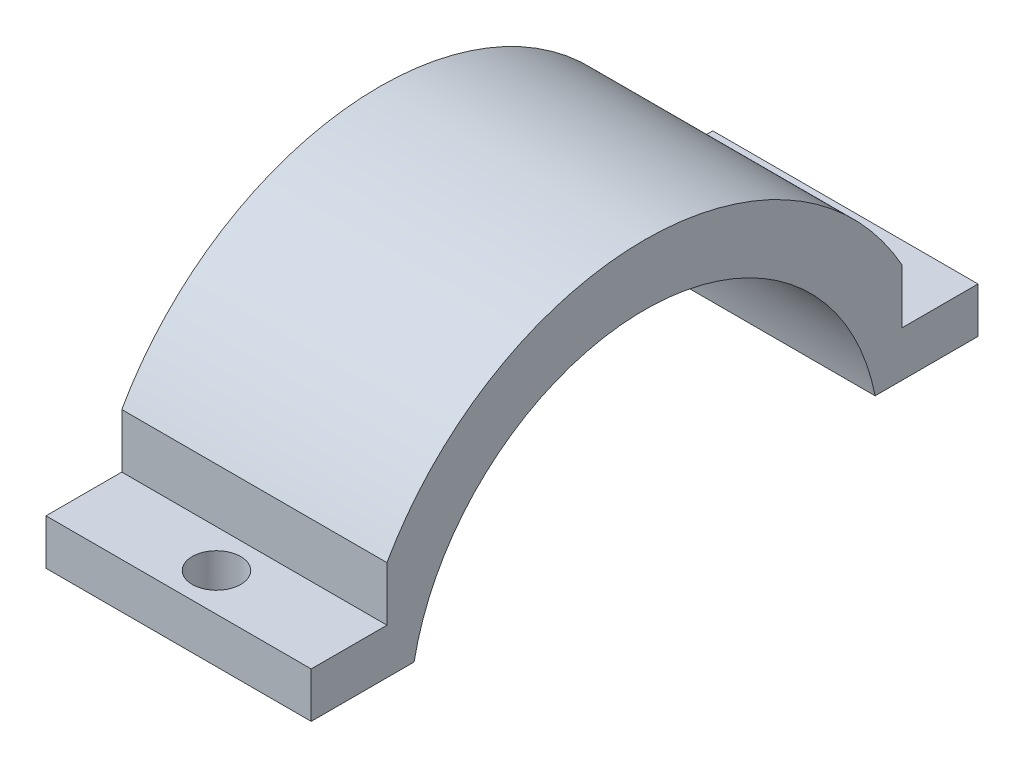
ISO-10303-21;
HEADER;
FILE_DESCRIPTION(('STEP AP214'),'2;1');
FILE_NAME('part.step','',(''),(''),'','','');
FILE_SCHEMA(('AUTOMOTIVE_DESIGN { 1 0 10303 214 1 1 1 1 }'));
ENDSEC;
DATA;
#1=APPLICATION_CONTEXT('core data for automotive mechanical design processes');
#2=APPLICATION_PROTOCOL_DEFINITION('international standard','automotive_design',2000,#1);
#3=PRODUCT_CONTEXT('',#1,'mechanical');
#4=PRODUCT('Part','Part','',(#3));
#5=PRODUCT_RELATED_PRODUCT_CATEGORY('part','',(#4));
#6=PRODUCT_DEFINITION_FORMATION('','',#4);
#7=PRODUCT_DEFINITION_CONTEXT('part definition',#1,'design');
#8=PRODUCT_DEFINITION('design','',#6,#7);
#9=PRODUCT_DEFINITION_SHAPE('','',#8);
#10=(LENGTH_UNIT() NAMED_UNIT(*) SI_UNIT(.MILLI.,.METRE.));
#11=(NAMED_UNIT(*) PLANE_ANGLE_UNIT() SI_UNIT($,.RADIAN.));
#12=(NAMED_UNIT(*) SI_UNIT($,.STERADIAN.) SOLID_ANGLE_UNIT());
#13=UNCERTAINTY_MEASURE_WITH_UNIT(LENGTH_MEASURE(1.E-05),#10,'distance_accuracy_value','');
#14=(GEOMETRIC_REPRESENTATION_CONTEXT(3) GLOBAL_UNCERTAINTY_ASSIGNED_CONTEXT((#13)) GLOBAL_UNIT_ASSIGNED_CONTEXT((#10,
#11,#12)) REPRESENTATION_CONTEXT('',''));
#15=CARTESIAN_POINT('',(0.,0.,0.));
#16=DIRECTION('',(0.,0.,1.));
#17=DIRECTION('',(1.,0.,0.));
#18=AXIS2_PLACEMENT_3D('',#15,#16,#17);
#19=CARTESIAN_POINT('',(17.,50.,0.));
#20=DIRECTION('',(-1.,0.,0.));
#21=DIRECTION('',(0.,0.,1.));
#22=AXIS2_PLACEMENT_3D('',#19,#20,#21);
#23=PLANE('',#22);
#24=DIRECTION('',(0.,0.,1.));
#25=VECTOR('',#24,1.);
#26=CARTESIAN_POINT('',(17.,7.4784321470105,39.));
#27=LINE('',#26,#25);
#28=CARTESIAN_POINT('',(17.,7.4784321470105,37.2111453199835));
#29=VERTEX_POINT('',#28);
#30=CARTESIAN_POINT('',(17.,7.47843214701051,44.));
#31=VERTEX_POINT('',#30);
#32=EDGE_CURVE('E188',#29,#31,#27,.T.);
#33=ORIENTED_EDGE('',*,*,#32,.F.);
#34=CARTESIAN_POINT('',(17.,4.50000000000002,22.));
#35=DIRECTION('',(1.,0.,0.));
#36=DIRECTION('',(0.,0.,-1.));
#37=AXIS2_PLACEMENT_3D('',#34,#35,#36);
#38=CIRCLE('',#37,15.5);
#39=CARTESIAN_POINT('',(17.,7.47843214701048,6.7888546800166));
#40=VERTEX_POINT('',#39);
#41=EDGE_CURVE('E144',#40,#29,#38,.T.);
#42=ORIENTED_EDGE('',*,*,#41,.F.);
#43=DIRECTION('',(0.,0.,1.));
#44=VECTOR('',#43,1.);
#45=CARTESIAN_POINT('',(17.,7.47843214701051,5.00000000000001));
#46=LINE('',#45,#44);
#47=CARTESIAN_POINT('',(17.,7.47843214701051,0.));
#48=VERTEX_POINT('',#47);
#49=EDGE_CURVE('E140',#48,#40,#46,.T.);
#50=ORIENTED_EDGE('',*,*,#49,.F.);
#51=DIRECTION('',(0.,-1.,0.));
#52=VECTOR('',#51,1.);
#53=CARTESIAN_POINT('',(17.,7.47843214701051,0.));
#54=LINE('',#53,#52);
#55=CARTESIAN_POINT('',(17.,10.4784321470105,0.));
#56=VERTEX_POINT('',#55);
#57=EDGE_CURVE('E114',#56,#48,#54,.T.);
#58=ORIENTED_EDGE('',*,*,#57,.F.);
#59=DIRECTION('',(0.,0.,-1.));
#60=VECTOR('',#59,1.);
#61=CARTESIAN_POINT('',(17.,10.4784321470105,0.));
#62=LINE('',#61,#60);
#63=CARTESIAN_POINT('',(17.,10.4784321470105,5.));
#64=VERTEX_POINT('',#63);
#65=EDGE_CURVE('E132',#64,#56,#62,.T.);
#66=ORIENTED_EDGE('',*,*,#65,.F.);
#67=DIRECTION('',(0.,1.,0.));
#68=VECTOR('',#67,1.);
#69=CARTESIAN_POINT('',(17.,0.,5.));
#70=LINE('',#69,#68);
#71=CARTESIAN_POINT('',(17.,14.0524865872713,5.00000000000001));
#72=VERTEX_POINT('',#71);
#73=EDGE_CURVE('E119',#64,#72,#70,.T.);
#74=ORIENTED_EDGE('',*,*,#73,.T.);
#75=CARTESIAN_POINT('',(17.,4.5,22.));
#76=DIRECTION('',(-1.,0.,0.));
#77=DIRECTION('',(0.,0.,1.));
#78=AXIS2_PLACEMENT_3D('',#75,#76,#77);
#79=CIRCLE('',#78,19.5);
#80=CARTESIAN_POINT('',(17.,14.0524865872714,39.));
#81=VERTEX_POINT('',#80);
#82=EDGE_CURVE('E76',#81,#72,#79,.T.);
#83=ORIENTED_EDGE('',*,*,#82,.F.);
#84=DIRECTION('',(0.,-1.,0.));
#85=VECTOR('',#84,1.);
#86=CARTESIAN_POINT('',(17.,50.,39.));
#87=LINE('',#86,#85);
#88=CARTESIAN_POINT('',(17.,10.4784321470105,39.));
#89=VERTEX_POINT('',#88);
#90=EDGE_CURVE('E43',#81,#89,#87,.T.);
#91=ORIENTED_EDGE('',*,*,#90,.T.);
#92=DIRECTION('',(0.,0.,-1.));
#93=VECTOR('',#92,1.);
#94=CARTESIAN_POINT('',(17.,10.4784321470105,44.));
#95=LINE('',#94,#93);
#96=CARTESIAN_POINT('',(17.,10.4784321470105,44.));
#97=VERTEX_POINT('',#96);
#98=EDGE_CURVE('E155',#97,#89,#95,.T.);
#99=ORIENTED_EDGE('',*,*,#98,.F.);
#100=DIRECTION('',(0.,1.,0.));
#101=VECTOR('',#100,1.);
#102=CARTESIAN_POINT('',(17.,7.47843214701051,44.));
#103=LINE('',#102,#101);
#104=EDGE_CURVE('E168',#31,#97,#103,.T.);
#105=ORIENTED_EDGE('',*,*,#104,.F.);
#106=EDGE_LOOP('',(#33,#42,#50,#58,#66,#74,#83,#91,#99,#105));
#107=FACE_BOUND('',#106,.T.);
#108=ADVANCED_FACE('F34',(#107),#23,.F.);
#109=CARTESIAN_POINT('',(-0.499999999999994,50.,0.));
#110=DIRECTION('',(-1.,0.,0.));
#111=DIRECTION('',(0.,0.,1.));
#112=AXIS2_PLACEMENT_3D('',#109,#110,#111);
#113=PLANE('',#112);
#114=CARTESIAN_POINT('',(-0.49999999999995,4.50000000000002,22.));
#115=DIRECTION('',(-1.,0.,0.));
#116=DIRECTION('',(0.,0.,1.));
#117=AXIS2_PLACEMENT_3D('',#114,#115,#116);
#118=CIRCLE('',#117,15.5);
#119=CARTESIAN_POINT('',(-0.499999999999921,7.47843214701053,37.2111453199835));
#120=VERTEX_POINT('',#119);
#121=CARTESIAN_POINT('',(-0.499999999999994,7.47843214701051,6.78885468001661));
#122=VERTEX_POINT('',#121);
#123=EDGE_CURVE('E11',#120,#122,#118,.T.);
#124=ORIENTED_EDGE('',*,*,#123,.F.);
#125=DIRECTION('',(0.,0.,1.));
#126=VECTOR('',#125,1.);
#127=CARTESIAN_POINT('',(-0.499999999999994,7.4784321470105,39.));
#128=LINE('',#127,#126);
#129=CARTESIAN_POINT('',(-0.499999999999994,7.47843214701051,44.));
#130=VERTEX_POINT('',#129);
#131=EDGE_CURVE('E197',#120,#130,#128,.T.);
#132=ORIENTED_EDGE('',*,*,#131,.T.);
#133=DIRECTION('',(0.,1.,0.));
#134=VECTOR('',#133,1.);
#135=CARTESIAN_POINT('',(-0.499999999999994,7.47843214701051,44.));
#136=LINE('',#135,#134);
#137=CARTESIAN_POINT('',(-0.499999999999994,10.4784321470105,44.));
#138=VERTEX_POINT('',#137);
#139=EDGE_CURVE('E217',#130,#138,#136,.T.);
#140=ORIENTED_EDGE('',*,*,#139,.T.);
#141=DIRECTION('',(0.,0.,-1.));
#142=VECTOR('',#141,1.);
#143=CARTESIAN_POINT('',(-0.499999999999994,10.4784321470105,44.));
#144=LINE('',#143,#142);
#145=CARTESIAN_POINT('',(-0.499999999999994,10.4784321470105,39.));
#146=VERTEX_POINT('',#145);
#147=EDGE_CURVE('E175',#138,#146,#144,.T.);
#148=ORIENTED_EDGE('',*,*,#147,.T.);
#149=DIRECTION('',(0.,-1.,0.));
#150=VECTOR('',#149,1.);
#151=CARTESIAN_POINT('',(-0.499999999999917,50.,39.));
#152=LINE('',#151,#150);
#153=CARTESIAN_POINT('',(-0.499999999999917,14.0524865872714,39.));
#154=VERTEX_POINT('',#153);
#155=EDGE_CURVE('E148',#154,#146,#152,.T.);
#156=ORIENTED_EDGE('',*,*,#155,.F.);
#157=CARTESIAN_POINT('',(-0.499999999999952,4.5,22.));
#158=DIRECTION('',(-1.,0.,0.));
#159=DIRECTION('',(0.,0.,1.));
#160=AXIS2_PLACEMENT_3D('',#157,#158,#159);
#161=CIRCLE('',#160,19.5);
#162=CARTESIAN_POINT('',(-0.499999999999973,14.0524865872713,5.00000000000001));
#163=VERTEX_POINT('',#162);
#164=EDGE_CURVE('E37',#154,#163,#161,.T.);
#165=ORIENTED_EDGE('',*,*,#164,.T.);
#166=DIRECTION('',(0.,1.,0.));
#167=VECTOR('',#166,1.);
#168=CARTESIAN_POINT('',(-0.499999999999994,0.,5.));
#169=LINE('',#168,#167);
#170=CARTESIAN_POINT('',(-0.499999999999994,10.4784321470105,5.00000000000001));
#171=VERTEX_POINT('',#170);
#172=EDGE_CURVE('E141',#171,#163,#169,.T.);
#173=ORIENTED_EDGE('',*,*,#172,.F.);
#174=DIRECTION('',(0.,0.,-1.));
#175=VECTOR('',#174,1.);
#176=CARTESIAN_POINT('',(-0.499999999999994,10.4784321470105,0.));
#177=LINE('',#176,#175);
#178=CARTESIAN_POINT('',(-0.499999999999994,10.4784321470105,0.));
#179=VERTEX_POINT('',#178);
#180=EDGE_CURVE('E51',#171,#179,#177,.T.);
#181=ORIENTED_EDGE('',*,*,#180,.T.);
#182=DIRECTION('',(0.,-1.,0.));
#183=VECTOR('',#182,1.);
#184=CARTESIAN_POINT('',(-0.499999999999994,7.47843214701051,0.));
#185=LINE('',#184,#183);
#186=CARTESIAN_POINT('',(-0.499999999999994,7.47843214701051,0.));
#187=VERTEX_POINT('',#186);
#188=EDGE_CURVE('E112',#179,#187,#185,.T.);
#189=ORIENTED_EDGE('',*,*,#188,.T.);
#190=DIRECTION('',(0.,0.,1.));
#191=VECTOR('',#190,1.);
#192=CARTESIAN_POINT('',(-0.499999999999994,7.47843214701051,5.00000000000001));
#193=LINE('',#192,#191);
#194=EDGE_CURVE('E125',#187,#122,#193,.T.);
#195=ORIENTED_EDGE('',*,*,#194,.T.);
#196=EDGE_LOOP('',(#124,#132,#140,#148,#156,#165,#173,#181,#189,#195));
#197=FACE_BOUND('',#196,.T.);
#198=ADVANCED_FACE('F124',(#197),#113,.T.);
#199=CARTESIAN_POINT('',(17.,50.,39.));
#200=DIRECTION('',(0.,0.,-1.));
#201=DIRECTION('',(-1.,0.,0.));
#202=AXIS2_PLACEMENT_3D('',#199,#200,#201);
#203=PLANE('',#202);
#204=DIRECTION('',(-1.,0.,0.));
#205=VECTOR('',#204,1.);
#206=CARTESIAN_POINT('',(17.,14.0524865872714,39.));
#207=LINE('',#206,#205);
#208=EDGE_CURVE('E207',#81,#154,#207,.T.);
#209=ORIENTED_EDGE('',*,*,#208,.T.);
#210=ORIENTED_EDGE('',*,*,#155,.T.);
#211=DIRECTION('',(-1.,0.,0.));
#212=VECTOR('',#211,1.);
#213=CARTESIAN_POINT('',(17.,10.4784321470105,39.));
#214=LINE('',#213,#212);
#215=EDGE_CURVE('E163',#89,#146,#214,.T.);
#216=ORIENTED_EDGE('',*,*,#215,.F.);
#217=ORIENTED_EDGE('',*,*,#90,.F.);
#218=EDGE_LOOP('',(#209,#210,#216,#217));
#219=FACE_BOUND('',#218,.T.);
#220=ADVANCED_FACE('F170',(#219),#203,.F.);
#221=CARTESIAN_POINT('',(-0.499999999999994,0.,5.));
#222=DIRECTION('',(0.,0.,-1.));
#223=DIRECTION('',(0.,1.,0.));
#224=AXIS2_PLACEMENT_3D('',#221,#222,#223);
#225=PLANE('',#224);
#226=ORIENTED_EDGE('',*,*,#172,.T.);
#227=DIRECTION('',(-1.,0.,0.));
#228=VECTOR('',#227,1.);
#229=CARTESIAN_POINT('',(17.,14.0524865872713,5.00000000000001));
#230=LINE('',#229,#228);
#231=EDGE_CURVE('E67',#72,#163,#230,.T.);
#232=ORIENTED_EDGE('',*,*,#231,.F.);
#233=ORIENTED_EDGE('',*,*,#73,.F.);
#234=DIRECTION('',(-1.,0.,0.));
#235=VECTOR('',#234,1.);
#236=CARTESIAN_POINT('',(17.,10.4784321470105,5.));
#237=LINE('',#236,#235);
#238=EDGE_CURVE('E138',#64,#171,#237,.T.);
#239=ORIENTED_EDGE('',*,*,#238,.T.);
#240=EDGE_LOOP('',(#226,#232,#233,#239));
#241=FACE_BOUND('',#240,.T.);
#242=ADVANCED_FACE('F221',(#241),#225,.T.);
#243=CARTESIAN_POINT('',(-0.49999999999999,4.50000000000002,22.));
#244=DIRECTION('',(1.,0.,0.));
#245=DIRECTION('',(0.,0.,-1.));
#246=AXIS2_PLACEMENT_3D('',#243,#244,#245);
#247=CYLINDRICAL_SURFACE('',#246,15.5);
#248=ORIENTED_EDGE('',*,*,#41,.T.);
#249=DIRECTION('',(1.,0.,0.));
#250=VECTOR('',#249,1.);
#251=CARTESIAN_POINT('',(-0.499999999999989,7.47843214701053,37.2111453199835));
#252=LINE('',#251,#250);
#253=EDGE_CURVE('E185',#120,#29,#252,.T.);
#254=ORIENTED_EDGE('',*,*,#253,.F.);
#255=ORIENTED_EDGE('',*,*,#123,.T.);
#256=DIRECTION('',(1.,0.,0.));
#257=VECTOR('',#256,1.);
#258=CARTESIAN_POINT('',(-0.499999999999991,7.47843214701051,6.78885468001661));
#259=LINE('',#258,#257);
#260=EDGE_CURVE('E131',#40,#122,#259,.F.);
#261=ORIENTED_EDGE('',*,*,#260,.F.);
#262=EDGE_LOOP('',(#248,#254,#255,#261));
#263=FACE_BOUND('',#262,.T.);
#264=ADVANCED_FACE('F183',(#263),#247,.F.);
#265=CARTESIAN_POINT('',(17.,7.47843214701051,5.00000000000001));
#266=DIRECTION('',(0.,-1.,0.));
#267=DIRECTION('',(0.,0.,-1.));
#268=AXIS2_PLACEMENT_3D('',#265,#266,#267);
#269=PLANE('',#268);
#270=CARTESIAN_POINT('',(8.25000000000001,7.47843214701051,2.5));
#271=DIRECTION('',(0.,-1.,0.));
#272=DIRECTION('',(0.,0.,-1.));
#273=AXIS2_PLACEMENT_3D('',#270,#271,#272);
#274=CIRCLE('',#273,1.6);
#275=CARTESIAN_POINT('',(8.25000000000001,7.47843214701051,0.900000000000002));
#276=VERTEX_POINT('',#275);
#277=EDGE_CURVE('E198',#276,#276,#274,.F.);
#278=ORIENTED_EDGE('',*,*,#277,.T.);
#279=EDGE_LOOP('',(#278));
#280=FACE_BOUND('',#279,.T.);
#281=ORIENTED_EDGE('',*,*,#194,.F.);
#282=DIRECTION('',(-1.,0.,0.));
#283=VECTOR('',#282,1.);
#284=CARTESIAN_POINT('',(17.,7.47843214701051,0.));
#285=LINE('',#284,#283);
#286=EDGE_CURVE('E109',#48,#187,#285,.T.);
#287=ORIENTED_EDGE('',*,*,#286,.F.);
#288=ORIENTED_EDGE('',*,*,#49,.T.);
#289=ORIENTED_EDGE('',*,*,#260,.T.);
#290=EDGE_LOOP('',(#281,#287,#288,#289));
#291=FACE_BOUND('',#290,.T.);
#292=ADVANCED_FACE('F129',(#280,#291),#269,.T.);
#293=CARTESIAN_POINT('',(17.,7.47843214701051,0.));
#294=DIRECTION('',(0.,0.,-1.));
#295=DIRECTION('',(0.,1.,0.));
#296=AXIS2_PLACEMENT_3D('',#293,#294,#295);
#297=PLANE('',#296);
#298=ORIENTED_EDGE('',*,*,#188,.F.);
#299=DIRECTION('',(-1.,0.,0.));
#300=VECTOR('',#299,1.);
#301=CARTESIAN_POINT('',(17.,10.4784321470105,0.));
#302=LINE('',#301,#300);
#303=EDGE_CURVE('E104',#56,#179,#302,.T.);
#304=ORIENTED_EDGE('',*,*,#303,.F.);
#305=ORIENTED_EDGE('',*,*,#57,.T.);
#306=ORIENTED_EDGE('',*,*,#286,.T.);
#307=EDGE_LOOP('',(#298,#304,#305,#306));
#308=FACE_BOUND('',#307,.T.);
#309=ADVANCED_FACE('F111',(#308),#297,.T.);
#310=CARTESIAN_POINT('',(17.,10.4784321470105,0.));
#311=DIRECTION('',(0.,1.,0.));
#312=DIRECTION('',(0.,0.,1.));
#313=AXIS2_PLACEMENT_3D('',#310,#311,#312);
#314=PLANE('',#313);
#315=CARTESIAN_POINT('',(8.25000000000001,10.4784321470105,2.5));
#316=DIRECTION('',(0.,1.,0.));
#317=DIRECTION('',(0.,0.,1.));
#318=AXIS2_PLACEMENT_3D('',#315,#316,#317);
#319=CIRCLE('',#318,1.6);
#320=CARTESIAN_POINT('',(8.25000000000001,10.4784321470105,4.1));
#321=VERTEX_POINT('',#320);
#322=EDGE_CURVE('E201',#321,#321,#319,.T.);
#323=ORIENTED_EDGE('',*,*,#322,.F.);
#324=EDGE_LOOP('',(#323));
#325=FACE_BOUND('',#324,.T.);
#326=ORIENTED_EDGE('',*,*,#180,.F.);
#327=ORIENTED_EDGE('',*,*,#238,.F.);
#328=ORIENTED_EDGE('',*,*,#65,.T.);
#329=ORIENTED_EDGE('',*,*,#303,.T.);
#330=EDGE_LOOP('',(#326,#327,#328,#329));
#331=FACE_BOUND('',#330,.T.);
#332=ADVANCED_FACE('F224',(#325,#331),#314,.T.);
#333=CARTESIAN_POINT('',(17.,10.4784321470105,44.));
#334=DIRECTION('',(0.,1.,0.));
#335=DIRECTION('',(0.,0.,1.));
#336=AXIS2_PLACEMENT_3D('',#333,#334,#335);
#337=PLANE('',#336);
#338=CARTESIAN_POINT('',(8.25000000000002,10.4784321470105,41.5));
#339=DIRECTION('',(0.,1.,0.));
#340=DIRECTION('',(0.,0.,1.));
#341=AXIS2_PLACEMENT_3D('',#338,#339,#340);
#342=CIRCLE('',#341,1.6);
#343=CARTESIAN_POINT('',(8.25000000000002,10.4784321470105,43.1));
#344=VERTEX_POINT('',#343);
#345=EDGE_CURVE('E204',#344,#344,#342,.T.);
#346=ORIENTED_EDGE('',*,*,#345,.F.);
#347=EDGE_LOOP('',(#346));
#348=FACE_BOUND('',#347,.T.);
#349=ORIENTED_EDGE('',*,*,#147,.F.);
#350=DIRECTION('',(-1.,0.,0.));
#351=VECTOR('',#350,1.);
#352=CARTESIAN_POINT('',(17.,10.4784321470105,44.));
#353=LINE('',#352,#351);
#354=EDGE_CURVE('E165',#97,#138,#353,.T.);
#355=ORIENTED_EDGE('',*,*,#354,.F.);
#356=ORIENTED_EDGE('',*,*,#98,.T.);
#357=ORIENTED_EDGE('',*,*,#215,.T.);
#358=EDGE_LOOP('',(#349,#355,#356,#357));
#359=FACE_BOUND('',#358,.T.);
#360=ADVANCED_FACE('F162',(#348,#359),#337,.T.);
#361=CARTESIAN_POINT('',(17.,7.47843214701051,44.));
#362=DIRECTION('',(0.,0.,1.));
#363=DIRECTION('',(1.,0.,0.));
#364=AXIS2_PLACEMENT_3D('',#361,#362,#363);
#365=PLANE('',#364);
#366=ORIENTED_EDGE('',*,*,#139,.F.);
#367=DIRECTION('',(-1.,0.,0.));
#368=VECTOR('',#367,1.);
#369=CARTESIAN_POINT('',(17.,7.47843214701051,44.));
#370=LINE('',#369,#368);
#371=EDGE_CURVE('E167',#31,#130,#370,.T.);
#372=ORIENTED_EDGE('',*,*,#371,.F.);
#373=ORIENTED_EDGE('',*,*,#104,.T.);
#374=ORIENTED_EDGE('',*,*,#354,.T.);
#375=EDGE_LOOP('',(#366,#372,#373,#374));
#376=FACE_BOUND('',#375,.T.);
#377=ADVANCED_FACE('F232',(#376),#365,.T.);
#378=CARTESIAN_POINT('',(17.,7.4784321470105,39.));
#379=DIRECTION('',(0.,-1.,0.));
#380=DIRECTION('',(0.,0.,-1.));
#381=AXIS2_PLACEMENT_3D('',#378,#379,#380);
#382=PLANE('',#381);
#383=CARTESIAN_POINT('',(8.25000000000002,7.47843214701051,41.5));
#384=DIRECTION('',(0.,-1.,0.));
#385=DIRECTION('',(0.,0.,-1.));
#386=AXIS2_PLACEMENT_3D('',#383,#384,#385);
#387=CIRCLE('',#386,1.6);
#388=CARTESIAN_POINT('',(8.25000000000002,7.47843214701051,39.9));
#389=VERTEX_POINT('',#388);
#390=EDGE_CURVE('E208',#389,#389,#387,.F.);
#391=ORIENTED_EDGE('',*,*,#390,.T.);
#392=EDGE_LOOP('',(#391));
#393=FACE_BOUND('',#392,.T.);
#394=ORIENTED_EDGE('',*,*,#131,.F.);
#395=ORIENTED_EDGE('',*,*,#253,.T.);
#396=ORIENTED_EDGE('',*,*,#32,.T.);
#397=ORIENTED_EDGE('',*,*,#371,.T.);
#398=EDGE_LOOP('',(#394,#395,#396,#397));
#399=FACE_BOUND('',#398,.T.);
#400=ADVANCED_FACE('F195',(#393,#399),#382,.T.);
#401=CARTESIAN_POINT('',(17.,4.5,22.));
#402=DIRECTION('',(-1.,0.,0.));
#403=DIRECTION('',(0.,0.,1.));
#404=AXIS2_PLACEMENT_3D('',#401,#402,#403);
#405=CYLINDRICAL_SURFACE('',#404,19.5);
#406=ORIENTED_EDGE('',*,*,#164,.F.);
#407=ORIENTED_EDGE('',*,*,#208,.F.);
#408=ORIENTED_EDGE('',*,*,#82,.T.);
#409=ORIENTED_EDGE('',*,*,#231,.T.);
#410=EDGE_LOOP('',(#406,#407,#408,#409));
#411=FACE_BOUND('',#410,.T.);
#412=ADVANCED_FACE('F317',(#411),#405,.T.);
#413=CARTESIAN_POINT('',(8.25000000000002,4.499,41.5));
#414=DIRECTION('',(0.,1.,0.));
#415=DIRECTION('',(0.,0.,1.));
#416=AXIS2_PLACEMENT_3D('',#413,#414,#415);
#417=CYLINDRICAL_SURFACE('',#416,1.6);
#418=ORIENTED_EDGE('',*,*,#390,.F.);
#419=EDGE_LOOP('',(#418));
#420=FACE_BOUND('',#419,.T.);
#421=ORIENTED_EDGE('',*,*,#345,.T.);
#422=EDGE_LOOP('',(#421));
#423=FACE_BOUND('',#422,.T.);
#424=ADVANCED_FACE('F322',(#420,#423),#417,.F.);
#425=CARTESIAN_POINT('',(8.25000000000001,4.499,2.5));
#426=DIRECTION('',(0.,1.,0.));
#427=DIRECTION('',(0.,0.,1.));
#428=AXIS2_PLACEMENT_3D('',#425,#426,#427);
#429=CYLINDRICAL_SURFACE('',#428,1.6);
#430=ORIENTED_EDGE('',*,*,#277,.F.);
#431=EDGE_LOOP('',(#430));
#432=FACE_BOUND('',#431,.T.);
#433=ORIENTED_EDGE('',*,*,#322,.T.);
#434=EDGE_LOOP('',(#433));
#435=FACE_BOUND('',#434,.T.);
#436=ADVANCED_FACE('F333',(#432,#435),#429,.F.);
#437=CLOSED_SHELL('',(#108,#198,#220,#242,#264,#292,#309,#332,#360,#377,#400,#412,#424,#436));
#438=MANIFOLD_SOLID_BREP('B2',#437);
#439=ADVANCED_BREP_SHAPE_REPRESENTATION('',(#18,#438),#14);
#440=SHAPE_DEFINITION_REPRESENTATION(#9,#439);
ENDSEC;
END-ISO-10303-21;
